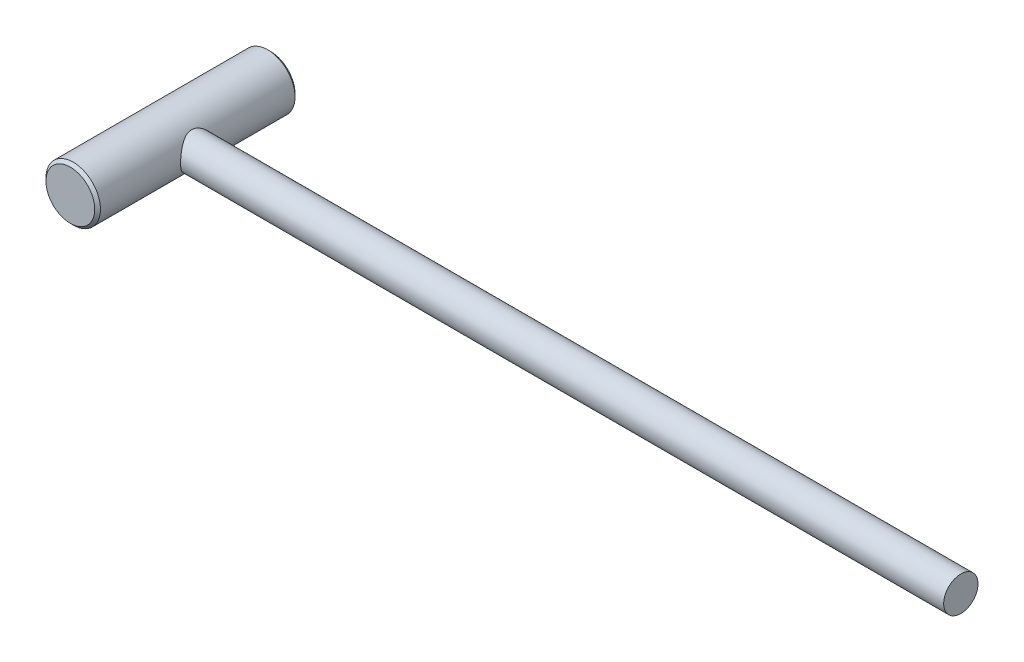
ISO-10303-21;
HEADER;
FILE_DESCRIPTION(('STEP AP214'),'2;1');
FILE_NAME('part.step','',(''),(''),'','','');
FILE_SCHEMA(('AUTOMOTIVE_DESIGN { 1 0 10303 214 1 1 1 1 }'));
ENDSEC;
DATA;
#1=APPLICATION_CONTEXT('core data for automotive mechanical design processes');
#2=APPLICATION_PROTOCOL_DEFINITION('international standard','automotive_design',2000,#1);
#3=PRODUCT_CONTEXT('',#1,'mechanical');
#4=PRODUCT('Part','Part','',(#3));
#5=PRODUCT_RELATED_PRODUCT_CATEGORY('part','',(#4));
#6=PRODUCT_DEFINITION_FORMATION('','',#4);
#7=PRODUCT_DEFINITION_CONTEXT('part definition',#1,'design');
#8=PRODUCT_DEFINITION('design','',#6,#7);
#9=PRODUCT_DEFINITION_SHAPE('','',#8);
#10=(LENGTH_UNIT() NAMED_UNIT(*) SI_UNIT(.MILLI.,.METRE.));
#11=(NAMED_UNIT(*) PLANE_ANGLE_UNIT() SI_UNIT($,.RADIAN.));
#12=(NAMED_UNIT(*) SI_UNIT($,.STERADIAN.) SOLID_ANGLE_UNIT());
#13=UNCERTAINTY_MEASURE_WITH_UNIT(LENGTH_MEASURE(1.E-05),#10,'distance_accuracy_value','');
#14=(GEOMETRIC_REPRESENTATION_CONTEXT(3) GLOBAL_UNCERTAINTY_ASSIGNED_CONTEXT((#13)) GLOBAL_UNIT_ASSIGNED_CONTEXT((#10,
#11,#12)) REPRESENTATION_CONTEXT('',''));
#15=CARTESIAN_POINT('',(0.,0.,0.));
#16=DIRECTION('',(0.,0.,1.));
#17=DIRECTION('',(1.,0.,0.));
#18=AXIS2_PLACEMENT_3D('',#15,#16,#17);
#19=CARTESIAN_POINT('',(-2.2375,0.,0.));
#20=DIRECTION('',(1.,0.,0.));
#21=DIRECTION('',(0.,0.,-1.));
#22=AXIS2_PLACEMENT_3D('',#19,#20,#21);
#23=CYLINDRICAL_SURFACE('',#22,3.);
#24=CARTESIAN_POINT('',(-2.2375,0.,0.));
#25=DIRECTION('',(1.,0.,0.));
#26=DIRECTION('',(0.,0.,-1.));
#27=AXIS2_PLACEMENT_3D('',#24,#25,#26);
#28=CIRCLE('',#27,3.);
#29=CARTESIAN_POINT('',(-2.2375,0.,-3.));
#30=VERTEX_POINT('',#29);
#31=EDGE_CURVE('E11',#30,#30,#28,.T.);
#32=ORIENTED_EDGE('',*,*,#31,.T.);
#33=EDGE_LOOP('',(#32));
#34=FACE_BOUND('',#33,.T.);
#35=CARTESIAN_POINT('',(138.1125,0.,0.));
#36=DIRECTION('',(1.,0.,0.));
#37=DIRECTION('',(0.,0.,-1.));
#38=AXIS2_PLACEMENT_3D('',#35,#36,#37);
#39=CIRCLE('',#38,3.);
#40=CARTESIAN_POINT('',(138.1125,0.,-3.));
#41=VERTEX_POINT('',#40);
#42=EDGE_CURVE('E50',#41,#41,#39,.T.);
#43=ORIENTED_EDGE('',*,*,#42,.F.);
#44=EDGE_LOOP('',(#43));
#45=FACE_BOUND('',#44,.T.);
#46=ADVANCED_FACE('F44',(#34,#45),#23,.T.);
#47=CARTESIAN_POINT('',(-2.2375,0.,0.));
#48=DIRECTION('',(1.,0.,0.));
#49=DIRECTION('',(0.,0.,-1.));
#50=AXIS2_PLACEMENT_3D('',#47,#48,#49);
#51=PLANE('',#50);
#52=ORIENTED_EDGE('',*,*,#31,.F.);
#53=EDGE_LOOP('',(#52));
#54=FACE_BOUND('',#53,.T.);
#55=ADVANCED_FACE('F59',(#54),#51,.F.);
#56=CARTESIAN_POINT('',(138.1125,0.,0.));
#57=DIRECTION('',(1.,0.,0.));
#58=DIRECTION('',(0.,0.,-1.));
#59=AXIS2_PLACEMENT_3D('',#56,#57,#58);
#60=PLANE('',#59);
#61=ORIENTED_EDGE('',*,*,#42,.T.);
#62=EDGE_LOOP('',(#61));
#63=FACE_BOUND('',#62,.T.);
#64=ADVANCED_FACE('F56',(#63),#60,.T.);
#65=CLOSED_SHELL('',(#46,#55,#64));
#66=MANIFOLD_SOLID_BREP('B2',#65);
#67=CARTESIAN_POINT('',(0.,0.,17.5));
#68=DIRECTION('',(0.,0.,-1.));
#69=DIRECTION('',(-1.,0.,0.));
#70=AXIS2_PLACEMENT_3D('',#67,#68,#69);
#71=CYLINDRICAL_SURFACE('',#70,4.7625);
#72=CARTESIAN_POINT('',(0.,0.,-17.));
#73=DIRECTION('',(0.,0.,1.));
#74=DIRECTION('',(1.,0.,0.));
#75=AXIS2_PLACEMENT_3D('',#72,#73,#74);
#76=CIRCLE('',#75,4.7625);
#77=CARTESIAN_POINT('',(4.7625,0.,-17.));
#78=VERTEX_POINT('',#77);
#79=EDGE_CURVE('E95',#78,#78,#76,.T.);
#80=ORIENTED_EDGE('',*,*,#79,.T.);
#81=EDGE_LOOP('',(#80));
#82=FACE_BOUND('',#81,.T.);
#83=CARTESIAN_POINT('',(0.,0.,17.));
#84=DIRECTION('',(0.,0.,1.));
#85=DIRECTION('',(1.,0.,0.));
#86=AXIS2_PLACEMENT_3D('',#83,#84,#85);
#87=CIRCLE('',#86,4.7625);
#88=CARTESIAN_POINT('',(4.7625,0.,17.));
#89=VERTEX_POINT('',#88);
#90=EDGE_CURVE('E99',#89,#89,#87,.F.);
#91=ORIENTED_EDGE('',*,*,#90,.T.);
#92=EDGE_LOOP('',(#91));
#93=FACE_BOUND('',#92,.T.);
#94=CARTESIAN_POINT('',(4.7625,0.,-2.55269999999999));
#95=CARTESIAN_POINT('',(4.76249098880235,-0.133010725212635,-2.55268964379867));
#96=CARTESIAN_POINT('',(4.75686946945859,-0.266150473765431,-2.54224254750752));
#97=CARTESIAN_POINT('',(4.73493161651338,-0.528416928200222,-2.50094810593185));
#98=CARTESIAN_POINT('',(4.71859903077654,-0.65753722292519,-2.47006975922688));
#99=CARTESIAN_POINT('',(4.67693169620457,-0.907591391619125,-2.38950654415423));
#100=CARTESIAN_POINT('',(4.65163351810328,-1.02855618076858,-2.3398980233904));
#101=CARTESIAN_POINT('',(4.59429080156353,-1.26022263695386,-2.22371903810193));
#102=CARTESIAN_POINT('',(4.56224619002103,-1.37092419275904,-2.1571483897748));
#103=CARTESIAN_POINT('',(4.49176745887541,-1.58720281127184,-2.00394127628112));
#104=CARTESIAN_POINT('',(4.45305008417146,-1.69194896558001,-1.91626449901122));
#105=CARTESIAN_POINT('',(4.37438851524018,-1.88603270195853,-1.7255971638965));
#106=CARTESIAN_POINT('',(4.33444327162364,-1.9753566464548,-1.62259320082082));
#107=CARTESIAN_POINT('',(4.25354414566989,-2.14437203225538,-1.39288446077793));
#108=CARTESIAN_POINT('',(4.21283782898772,-2.22241194843764,-1.26486935624726));
#109=CARTESIAN_POINT('',(4.13987618533771,-2.35555632484889,-0.995067765402416));
#110=CARTESIAN_POINT('',(4.10761430609905,-2.41067858717423,-0.853292074106155));
#111=CARTESIAN_POINT('',(4.07032569007727,-2.47272606510712,-0.638003515832112));
#112=CARTESIAN_POINT('',(4.05993120644853,-2.48970523055954,-0.56818925274696));
#113=CARTESIAN_POINT('',(4.04259165591528,-2.51776401691393,-0.426979530779262));
#114=CARTESIAN_POINT('',(4.03564461750227,-2.52884700995271,-0.355585000073425));
#115=CARTESIAN_POINT('',(4.02553151743052,-2.54491533358276,-0.211904952389966));
#116=CARTESIAN_POINT('',(4.02236227158716,-2.54990579946283,-0.139620237721977));
#117=CARTESIAN_POINT('',(4.01993822313243,-2.55372308203532,0.00515314867050522));
#118=CARTESIAN_POINT('',(4.02068293690538,-2.55255066022488,0.0776417940907451));
#119=CARTESIAN_POINT('',(4.02800492624163,-2.54100388905884,0.273696967922614));
#120=CARTESIAN_POINT('',(4.03836185769022,-2.5246651742984,0.396835115811496));
#121=CARTESIAN_POINT('',(4.06915015594413,-2.47472218368951,0.638169832512543));
#122=CARTESIAN_POINT('',(4.0895856553847,-2.4411108250957,0.756364352645197));
#123=CARTESIAN_POINT('',(4.13859270771871,-2.35708741896314,0.987886259714855));
#124=CARTESIAN_POINT('',(4.16733585302726,-2.30631675120197,1.10104588215806));
#125=CARTESIAN_POINT('',(4.22976918640491,-2.1897094891113,1.31780864528501));
#126=CARTESIAN_POINT('',(4.26346155725784,-2.12386624004809,1.4214075363524));
#127=CARTESIAN_POINT('',(4.33802696064362,-1.96760781195701,1.63232419135211));
#128=CARTESIAN_POINT('',(4.37922294315676,-1.87499501079218,1.73790593148893));
#129=CARTESIAN_POINT('',(4.4601649277761,-1.67336335526017,1.9328245242567));
#130=CARTESIAN_POINT('',(4.49991001623471,-1.56433437750387,2.02215127730143));
#131=CARTESIAN_POINT('',(4.5763917759162,-1.32468324202182,2.18721416562952));
#132=CARTESIAN_POINT('',(4.61279929234333,-1.19315198407084,2.2617959040814));
#133=CARTESIAN_POINT('',(4.67552509004842,-0.916979596471013,2.38712375174052));
#134=CARTESIAN_POINT('',(4.70185245015776,-0.77235040954369,2.43789131883313));
#135=CARTESIAN_POINT('',(4.73939331136952,-0.488080329056998,2.50949337492322));
#136=CARTESIAN_POINT('',(4.75175814218215,-0.349170811444369,2.53261931085693));
#137=CARTESIAN_POINT('',(4.76406150309985,-0.0689219158761741,2.5556326156571));
#138=CARTESIAN_POINT('',(4.76400733493945,0.072415985431278,2.55553363957999));
#139=CARTESIAN_POINT('',(4.7520833850334,0.339650983455028,2.53322562091652));
#140=CARTESIAN_POINT('',(4.74129888928374,0.465774318802015,2.51304740877966));
#141=CARTESIAN_POINT('',(4.71053722661955,0.712537626335269,2.45451639262237));
#142=CARTESIAN_POINT('',(4.69055910768915,0.833177029228792,2.4161617063838));
#143=CARTESIAN_POINT('',(4.64256103828232,1.06905917299225,2.32162434163874));
#144=CARTESIAN_POINT('',(4.61435556425833,1.18409649572934,2.2650267920089));
#145=CARTESIAN_POINT('',(4.55246780360647,1.40336835592432,2.13612474083301));
#146=CARTESIAN_POINT('',(4.51878340127856,1.50759869468087,2.06381416803074));
#147=CARTESIAN_POINT('',(4.44475377637957,1.71431883882202,1.89655748169114));
#148=CARTESIAN_POINT('',(4.40408232061852,1.81539561783248,1.80000748317423));
#149=CARTESIAN_POINT('',(4.32308449739054,2.00064740682592,1.59158872361424));
#150=CARTESIAN_POINT('',(4.28275849024289,2.08480643987576,1.47970564828245));
#151=CARTESIAN_POINT('',(4.20407045646692,2.23947307166172,1.23429651799097));
#152=CARTESIAN_POINT('',(4.16603550238838,2.30863949760072,1.09981013100031));
#153=CARTESIAN_POINT('',(4.10079152659642,2.42266008242933,0.818499971006808));
#154=CARTESIAN_POINT('',(4.07356702571443,2.46754903712097,0.671694205540883));
#155=CARTESIAN_POINT('',(4.03674364253578,2.52729778402254,0.385113651802699));
#156=CARTESIAN_POINT('',(4.02568036252787,2.54466681778381,0.246057189802574));
#157=CARTESIAN_POINT('',(4.01830814016972,2.5563011234204,-0.0333713353942719));
#158=CARTESIAN_POINT('',(4.02198876257521,2.55058273578293,-0.173742397983291));
#159=CARTESIAN_POINT('',(4.04205315389449,2.51862556826253,-0.43331756424444));
#160=CARTESIAN_POINT('',(4.05680752246453,2.49501540323602,-0.552990409347255));
#161=CARTESIAN_POINT('',(4.09516228857035,2.43154660226388,-0.786448268334709));
#162=CARTESIAN_POINT('',(4.11876601573798,2.39168184992334,-0.900231047679504));
#163=CARTESIAN_POINT('',(4.17396973933278,2.29405914044268,-1.12683588493574));
#164=CARTESIAN_POINT('',(4.20598483203889,2.23531926330951,-1.23913035275194));
#165=CARTESIAN_POINT('',(4.27388552258492,2.10258619560409,-1.45302220792966));
#166=CARTESIAN_POINT('',(4.30977319787822,2.02858479837453,-1.55461379538369));
#167=CARTESIAN_POINT('',(4.38766327037059,1.85476257610506,-1.75975729437707));
#168=CARTESIAN_POINT('',(4.429790899149,1.75274711776143,-1.86141383055353));
#169=CARTESIAN_POINT('',(4.51080336994153,1.53227938854424,-2.04674558862592));
#170=CARTESIAN_POINT('',(4.54968606809948,1.41381638664,-2.13040897949709));
#171=CARTESIAN_POINT('',(4.62115973402213,1.15935653581823,-2.27911485527016));
#172=CARTESIAN_POINT('',(4.6535622426024,1.0229858225169,-2.34362053823107));
#173=CARTESIAN_POINT('',(4.69360949259479,0.810354136726025,-2.42184305936679));
#174=CARTESIAN_POINT('',(4.70552786787987,0.738177017105292,-2.44481960268165));
#175=CARTESIAN_POINT('',(4.72618319128206,0.591654368621044,-2.48434438914203));
#176=CARTESIAN_POINT('',(4.73492188777556,0.517310055774748,-2.50089616534178));
#177=CARTESIAN_POINT('',(4.74870989489233,0.36945865922132,-2.52690216627463));
#178=CARTESIAN_POINT('',(4.75386561689459,0.295997593212413,-2.53656135429205));
#179=CARTESIAN_POINT('',(4.76076319811587,0.148371074823479,-2.54946318822528));
#180=CARTESIAN_POINT('',(4.76250502727486,0.0742056162469063,-2.55270577764161));
#181=CARTESIAN_POINT('',(4.7625,0.,-2.55269999999999));
#182=B_SPLINE_CURVE_WITH_KNOTS('',3,(#94,#95,#96,#97,#98,#99,#100,#101,#102,#103,#104,#105,#106,
#107,#108,#109,#110,#111,#112,#113,#114,#115,#116,#117,#118,#119,#120,#121,#122,#123,#124,#125,
#126,#127,#128,#129,#130,#131,#132,#133,#134,#135,#136,#137,#138,#139,#140,#141,#142,#143,#144,
#145,#146,#147,#148,#149,#150,#151,#152,#153,#154,#155,#156,#157,#158,#159,#160,#161,#162,#163,
#164,#165,#166,#167,#168,#169,#170,#171,#172,#173,#174,#175,#176,#177,#178,#179,#180,#181),
.UNSPECIFIED.,.T.,.F.,(4,2,2,2,2,2,2,2,2,2,2,2,2,2,2,2,2,2,2,2,2,2,2,2,2,2,2,2,2,2,2,2,2,2,2,2,
2,2,2,2,2,2,2,4),(0.,0.398744238806956,0.798094905161078,1.1958350182989,1.59357944155231,
2.01778548315234,2.44236474214415,2.90615653083268,3.3695873767243,3.58710012930242,
3.80448834796605,4.02169320696258,4.23887122837853,4.61088027724346,4.98304199239026,
5.36351944082244,5.74416519992698,6.18138872124926,6.61888297860976,7.0829389167739,
7.54657590784172,7.96829168463189,8.38975951480832,8.77253103182731,9.15534219443258,
9.54755882316936,9.9399272683481,10.3748218055769,10.8101251426226,11.2754392964622,
11.7400847571832,12.1592497247819,12.578118073779,12.9451200616591,13.3122602753616,
13.7028986370795,14.0937476091053,14.5418865724944,14.9903193056554,15.4503351472803,
15.6800656183649,15.9096695784061,16.1321238307522,16.3545800418455),.UNSPECIFIED.);
#183=CARTESIAN_POINT('',(4.7625,0.,-2.55269999999999));
#184=VERTEX_POINT('',#183);
#185=EDGE_CURVE('E104',#184,#184,#182,.T.);
#186=ORIENTED_EDGE('',*,*,#185,.T.);
#187=EDGE_LOOP('',(#186));
#188=FACE_BOUND('',#187,.T.);
#189=CARTESIAN_POINT('',(-4.76248490290588,-0.0119901310166823,-0.00850262597107561));
#190=CARTESIAN_POINT('',(-4.76248610769685,-0.011511187147968,-0.00917448404786312));
#191=CARTESIAN_POINT('',(-4.76248738878058,-0.0109750956687767,-0.00980634778648819));
#192=CARTESIAN_POINT('',(-4.76248994605583,-0.00980400162921756,-0.0109716447651077));
#193=CARTESIAN_POINT('',(-4.76249122223942,-0.0091688786450122,-0.0115049564157966));
#194=CARTESIAN_POINT('',(-4.76249362991686,-0.00781835804453477,-0.0124574001125722));
#195=CARTESIAN_POINT('',(-4.76249476145859,-0.00710298714174079,-0.0128765699966348));
#196=CARTESIAN_POINT('',(-4.7624967514079,-0.005612350888962,-0.0135890648601971));
#197=CARTESIAN_POINT('',(-4.76249760988211,-0.0048371002069753,-0.0138824205441778));
#198=CARTESIAN_POINT('',(-4.76249895998778,-0.00324646178623126,-0.0143358628984184));
#199=CARTESIAN_POINT('',(-4.76249945070098,-0.00243097896120742,-0.0144956160896511));
#200=CARTESIAN_POINT('',(-4.76250000647319,-0.00078473741032952,-0.0146761609953339));
#201=CARTESIAN_POINT('',(-4.76250007151061,4.60220880467214E-05,-0.0146969456628353));
#202=CARTESIAN_POINT('',(-4.76249976838714,0.00170038880984421,-0.0145988915102823));
#203=CARTESIAN_POINT('',(-4.7624993996429,0.00252398489829914,-0.0144798646761556));
#204=CARTESIAN_POINT('',(-4.76249826954285,0.00413949812153826,-0.0141052027238044));
#205=CARTESIAN_POINT('',(-4.76249750818739,0.00493141528468837,-0.0138495677279044));
#206=CARTESIAN_POINT('',(-4.76249567900735,0.00646085813500534,-0.013208926885853));
#207=CARTESIAN_POINT('',(-4.76249461125384,0.0071983963866893,-0.0128239510395));
#208=CARTESIAN_POINT('',(-4.76249228988525,0.00859822125992877,-0.0119354369488904));
#209=CARTESIAN_POINT('',(-4.76249103627191,0.00926050859007449,-0.0114318998211876));
#210=CARTESIAN_POINT('',(-4.76248848741187,0.010489767525518,-0.0103214533610855));
#211=CARTESIAN_POINT('',(-4.76248719224126,0.0110569026515918,-0.00971472505527769));
#212=CARTESIAN_POINT('',(-4.76248470480457,0.0120809556718226,-0.00841445926680201));
#213=CARTESIAN_POINT('',(-4.76248351253725,0.012537874917205,-0.00772092284854316));
#214=CARTESIAN_POINT('',(-4.76248136885784,0.0133273178812937,-0.00626857941948996));
#215=CARTESIAN_POINT('',(-4.76248041685321,0.0136601486208644,-0.00550993929377863));
#216=CARTESIAN_POINT('',(-4.76247885756676,0.0141934084570507,-0.00394747153368115));
#217=CARTESIAN_POINT('',(-4.76247825028027,0.0143938393515644,-0.00314364451306259));
#218=CARTESIAN_POINT('',(-4.76247745009902,0.0146562179364576,-0.00151547675327789));
#219=CARTESIAN_POINT('',(-4.76247725631589,0.0147184625199334,-0.000691183848353101));
#220=CARTESIAN_POINT('',(-4.76247730237664,0.0147035503853296,0.000956136807004486));
#221=CARTESIAN_POINT('',(-4.7624775422175,0.0146263946380784,0.00177916456620821));
#222=CARTESIAN_POINT('',(-4.76247842804893,0.0143350367309683,0.00339986040874501));
#223=CARTESIAN_POINT('',(-4.76247907369222,0.0141209517472775,0.00419754956335798));
#224=CARTESIAN_POINT('',(-4.76248069807562,0.0135620070040822,0.00574570750880779));
#225=CARTESIAN_POINT('',(-4.76248167681638,0.0132171469845086,0.00649617620573499));
#226=CARTESIAN_POINT('',(-4.76248385822413,0.0124062077764909,0.00792929021313369));
#227=CARTESIAN_POINT('',(-4.76248506107434,0.0119400292786879,0.00861187932281271));
#228=CARTESIAN_POINT('',(-4.76248755499087,0.0108999183655002,0.00988931673499482));
#229=CARTESIAN_POINT('',(-4.76248884605808,0.0103259848546735,0.0104841641454023));
#230=CARTESIAN_POINT('',(-4.76249137435584,0.00908537103142317,0.0115706064621506));
#231=CARTESIAN_POINT('',(-4.76249261146606,0.00841849606814031,0.0120619790885787));
#232=CARTESIAN_POINT('',(-4.7624948900142,0.00701188452079276,0.0129261198894292));
#233=CARTESIAN_POINT('',(-4.76249593144947,0.00627214694651645,0.0132988864516896));
#234=CARTESIAN_POINT('',(-4.76249770416087,0.00473882906219548,0.0139161942131572));
#235=CARTESIAN_POINT('',(-4.76249843465775,0.00394511919282581,0.0141604136193903));
#236=CARTESIAN_POINT('',(-4.76249949962104,0.00232799683624475,0.0145123992984514));
#237=CARTESIAN_POINT('',(-4.76249983408277,0.00150458399791144,0.0146201639576897));
#238=CARTESIAN_POINT('',(-4.76250006961584,-0.000150129647957185,0.0146963032325228));
#239=CARTESIAN_POINT('',(-4.7624999699179,-0.000981441850473522,0.014664430426123));
#240=CARTESIAN_POINT('',(-4.76249934659955,-0.0026269292583124,0.0144616199165713));
#241=CARTESIAN_POINT('',(-4.76249882297781,-0.00344110441004426,0.0142906817786029));
#242=CARTESIAN_POINT('',(-4.76249741062219,-0.00502942722579414,0.0138144501443615));
#243=CARTESIAN_POINT('',(-4.76249652178292,-0.00580356326288423,0.0135091178635586));
#244=CARTESIAN_POINT('',(-4.76249447936107,-0.00728949314708827,0.0127726540696615));
#245=CARTESIAN_POINT('',(-4.76249332577933,-0.00800128719041379,0.0123415229525178));
#246=CARTESIAN_POINT('',(-4.7624908860422,-0.00934127753833209,0.0113662562932028));
#247=CARTESIAN_POINT('',(-4.76248960006427,-0.0099695832239024,0.0108222710482832));
#248=CARTESIAN_POINT('',(-4.7624870397898,-0.0111256824727545,0.00963631148300816));
#249=CARTESIAN_POINT('',(-4.76248576549313,-0.0116534770545345,0.00899433815570337));
#250=CARTESIAN_POINT('',(-4.76248337594673,-0.0125922364708663,0.00763223171958799));
#251=CARTESIAN_POINT('',(-4.76248226033077,-0.0130034725596892,0.00691228556117742));
#252=CARTESIAN_POINT('',(-4.76248031092846,-0.013698888981114,0.00541347541712131));
#253=CARTESIAN_POINT('',(-4.76247947712713,-0.0139830760664337,0.00463461456539428));
#254=CARTESIAN_POINT('',(-4.76247818743288,-0.0144156625162477,0.00304213895522986));
#255=CARTESIAN_POINT('',(-4.76247773060773,-0.0145643969423152,0.00222861519284843));
#256=CARTESIAN_POINT('',(-4.76247724295827,-0.0147229986471191,0.000587920285406782));
#257=CARTESIAN_POINT('',(-4.76247721223585,-0.0147328327107707,-0.000239254076563381));
#258=CARTESIAN_POINT('',(-4.76247758033681,-0.0146133674980138,-0.00188269637919492));
#259=CARTESIAN_POINT('',(-4.76247797879221,-0.0144841874122797,-0.00269897305645625));
#260=CARTESIAN_POINT('',(-4.76247915910487,-0.0140906482509636,-0.00429754266491773));
#261=CARTESIAN_POINT('',(-4.76247994050009,-0.0138264520626325,-0.00507987531614147));
#262=CARTESIAN_POINT('',(-4.76248144766574,-0.0132948878638526,-0.0063036493337562));
#263=CARTESIAN_POINT('',(-4.76248208320428,-0.0130663200052698,-0.00676234755160253));
#264=CARTESIAN_POINT('',(-4.7624834370041,-0.0125625473597071,-0.00765337293855678));
#265=CARTESIAN_POINT('',(-4.76248415526519,-0.0122873426804492,-0.00808570016857343));
#266=CARTESIAN_POINT('',(-4.76248490290588,-0.0119901310166823,-0.00850262597107561));
#267=B_SPLINE_CURVE_WITH_KNOTS('',3,(#189,#190,#191,#192,#193,#194,#195,#196,#197,#198,#199,
#200,#201,#202,#203,#204,#205,#206,#207,#208,#209,#210,#211,#212,#213,#214,#215,#216,#217,#218,
#219,#220,#221,#222,#223,#224,#225,#226,#227,#228,#229,#230,#231,#232,#233,#234,#235,#236,#237,
#238,#239,#240,#241,#242,#243,#244,#245,#246,#247,#248,#249,#250,#251,#252,#253,#254,#255,#256,
#257,#258,#259,#260,#261,#262,#263,#264,#265,#266),.UNSPECIFIED.,.T.,.F.,(4,2,2,2,2,2,2,2,2,2,2,
2,2,2,2,2,2,2,2,2,2,2,2,2,2,2,2,2,2,2,2,2,2,2,2,2,2,2,4),(0.,0.0024734140409095,
0.00494985959125537,0.00742548319814977,0.00990050229417091,0.0123816808874902,
0.0148629852978291,0.0173476303113584,0.0198322731000385,0.0223163399888238,0.0248003834847872,
0.0272801133830775,0.0297598128788143,0.0322333357105636,0.0347068249528946,0.0371749947429322,
0.0396431473439132,0.0421091906625112,0.0445752388852952,0.0470433121602562,0.0495114105271132,
0.0519847578548787,0.05445813880037,0.0569376822791922,0.0594172550785693,0.0619012231792432,
0.0643851990465839,0.0668698922298993,0.0693545775927553,0.0718359748945796,0.074317347050594,
0.0767928962472036,0.0792683138514955,0.0817375913905662,0.0842074593951581,0.0866752114219401,
0.0891399932863937,0.0906748896454154,0.0922097824591733),.UNSPECIFIED.);
#268=CARTESIAN_POINT('',(-4.76248490290588,-0.0119901310166823,-0.00850262597107561));
#269=VERTEX_POINT('',#268);
#270=EDGE_CURVE('E111',#269,#269,#267,.T.);
#271=ORIENTED_EDGE('',*,*,#270,.T.);
#272=EDGE_LOOP('',(#271));
#273=FACE_BOUND('',#272,.T.);
#274=ADVANCED_FACE('F84',(#82,#93,#188,#273),#71,.T.);
#275=CARTESIAN_POINT('',(0.,0.,17.5));
#276=DIRECTION('',(0.,0.,1.));
#277=DIRECTION('',(1.,0.,0.));
#278=AXIS2_PLACEMENT_3D('',#275,#276,#277);
#279=PLANE('',#278);
#280=CARTESIAN_POINT('',(0.,0.,17.5));
#281=DIRECTION('',(0.,0.,1.));
#282=DIRECTION('',(1.,0.,0.));
#283=AXIS2_PLACEMENT_3D('',#280,#281,#282);
#284=CIRCLE('',#283,4.2625);
#285=CARTESIAN_POINT('',(4.2625,0.,17.5));
#286=VERTEX_POINT('',#285);
#287=EDGE_CURVE('E43',#286,#286,#284,.T.);
#288=ORIENTED_EDGE('',*,*,#287,.T.);
#289=EDGE_LOOP('',(#288));
#290=FACE_BOUND('',#289,.T.);
#291=ADVANCED_FACE('F129',(#290),#279,.T.);
#292=CARTESIAN_POINT('',(0.,0.,-17.5));
#293=DIRECTION('',(0.,0.,1.));
#294=DIRECTION('',(1.,0.,0.));
#295=AXIS2_PLACEMENT_3D('',#292,#293,#294);
#296=PLANE('',#295);
#297=CARTESIAN_POINT('',(0.,0.,-17.5));
#298=DIRECTION('',(0.,0.,1.));
#299=DIRECTION('',(1.,0.,0.));
#300=AXIS2_PLACEMENT_3D('',#297,#298,#299);
#301=CIRCLE('',#300,4.26249999999999);
#302=CARTESIAN_POINT('',(4.26249999999999,0.,-17.5));
#303=VERTEX_POINT('',#302);
#304=EDGE_CURVE('E91',#303,#303,#301,.F.);
#305=ORIENTED_EDGE('',*,*,#304,.T.);
#306=EDGE_LOOP('',(#305));
#307=FACE_BOUND('',#306,.T.);
#308=ADVANCED_FACE('F122',(#307),#296,.F.);
#309=CARTESIAN_POINT('',(4.7625,0.,0.));
#310=DIRECTION('',(1.,0.,0.));
#311=DIRECTION('',(0.,0.,-1.));
#312=AXIS2_PLACEMENT_3D('',#309,#310,#311);
#313=CYLINDRICAL_SURFACE('',#312,2.55269999999999);
#314=CARTESIAN_POINT('',(-3.2375,0.,0.));
#315=DIRECTION('',(1.,0.,0.));
#316=DIRECTION('',(0.,0.,-1.));
#317=AXIS2_PLACEMENT_3D('',#314,#315,#316);
#318=CIRCLE('',#317,2.5527);
#319=CARTESIAN_POINT('',(-3.2375,0.,-2.5527));
#320=VERTEX_POINT('',#319);
#321=EDGE_CURVE('E147',#320,#320,#318,.T.);
#322=ORIENTED_EDGE('',*,*,#321,.F.);
#323=EDGE_LOOP('',(#322));
#324=FACE_BOUND('',#323,.T.);
#325=ORIENTED_EDGE('',*,*,#185,.F.);
#326=EDGE_LOOP('',(#325));
#327=FACE_BOUND('',#326,.T.);
#328=ADVANCED_FACE('F118',(#324,#327),#313,.F.);
#329=CARTESIAN_POINT('',(-3.2375,0.,0.));
#330=DIRECTION('',(1.,0.,0.));
#331=DIRECTION('',(0.,0.,-1.));
#332=AXIS2_PLACEMENT_3D('',#329,#330,#331);
#333=CONICAL_SURFACE('',#332,2.5527,1.02974425867665);
#334=ORIENTED_EDGE('',*,*,#321,.T.);
#335=EDGE_LOOP('',(#334));
#336=FACE_BOUND('',#335,.T.);
#337=ORIENTED_EDGE('',*,*,#270,.F.);
#338=EDGE_LOOP('',(#337));
#339=FACE_BOUND('',#338,.T.);
#340=ADVANCED_FACE('F121',(#336,#339),#333,.F.);
#341=CARTESIAN_POINT('',(0.,0.,-17.));
#342=DIRECTION('',(0.,0.,1.));
#343=DIRECTION('',(1.,0.,0.));
#344=AXIS2_PLACEMENT_3D('',#341,#342,#343);
#345=CONICAL_SURFACE('',#344,4.7625,0.785398163397456);
#346=ORIENTED_EDGE('',*,*,#304,.F.);
#347=EDGE_LOOP('',(#346));
#348=FACE_BOUND('',#347,.T.);
#349=ORIENTED_EDGE('',*,*,#79,.F.);
#350=EDGE_LOOP('',(#349));
#351=FACE_BOUND('',#350,.T.);
#352=ADVANCED_FACE('F127',(#348,#351),#345,.T.);
#353=CARTESIAN_POINT('',(0.,0.,17.5));
#354=DIRECTION('',(0.,0.,-1.));
#355=DIRECTION('',(-1.,0.,0.));
#356=AXIS2_PLACEMENT_3D('',#353,#354,#355);
#357=CONICAL_SURFACE('',#356,4.2625,0.785398163397442);
#358=ORIENTED_EDGE('',*,*,#90,.F.);
#359=EDGE_LOOP('',(#358));
#360=FACE_BOUND('',#359,.T.);
#361=ORIENTED_EDGE('',*,*,#287,.F.);
#362=EDGE_LOOP('',(#361));
#363=FACE_BOUND('',#362,.T.);
#364=ADVANCED_FACE('F86',(#360,#363),#357,.T.);
#365=CLOSED_SHELL('',(#274,#291,#308,#328,#340,#352,#364));
#366=MANIFOLD_SOLID_BREP('B6',#365);
#367=ADVANCED_BREP_SHAPE_REPRESENTATION('',(#18,#66,#366),#14);
#368=SHAPE_DEFINITION_REPRESENTATION(#9,#367);
ENDSEC;
END-ISO-10303-21;
